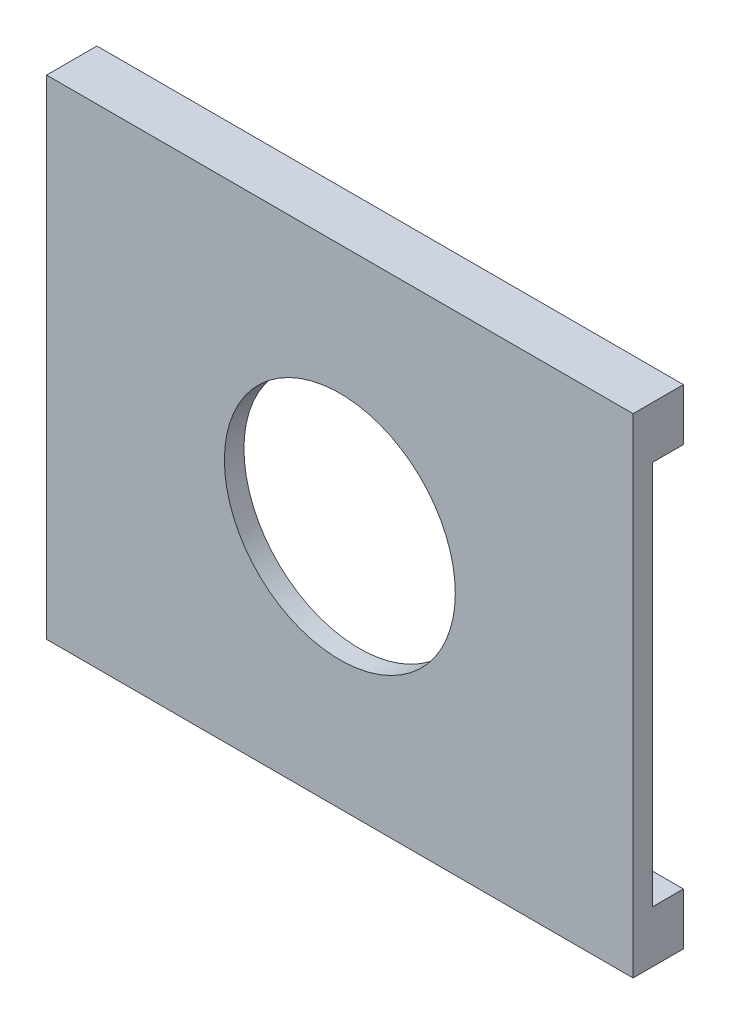
ISO-10303-21;
HEADER;
FILE_DESCRIPTION(('STEP AP214'),'2;1');
FILE_NAME('part.step','',(''),(''),'','','');
FILE_SCHEMA(('AUTOMOTIVE_DESIGN { 1 0 10303 214 1 1 1 1 }'));
ENDSEC;
DATA;
#1=APPLICATION_CONTEXT('core data for automotive mechanical design processes');
#2=APPLICATION_PROTOCOL_DEFINITION('international standard','automotive_design',2000,#1);
#3=PRODUCT_CONTEXT('',#1,'mechanical');
#4=PRODUCT('Part','Part','',(#3));
#5=PRODUCT_RELATED_PRODUCT_CATEGORY('part','',(#4));
#6=PRODUCT_DEFINITION_FORMATION('','',#4);
#7=PRODUCT_DEFINITION_CONTEXT('part definition',#1,'design');
#8=PRODUCT_DEFINITION('design','',#6,#7);
#9=PRODUCT_DEFINITION_SHAPE('','',#8);
#10=(LENGTH_UNIT() NAMED_UNIT(*) SI_UNIT(.MILLI.,.METRE.));
#11=(NAMED_UNIT(*) PLANE_ANGLE_UNIT() SI_UNIT($,.RADIAN.));
#12=(NAMED_UNIT(*) SI_UNIT($,.STERADIAN.) SOLID_ANGLE_UNIT());
#13=UNCERTAINTY_MEASURE_WITH_UNIT(LENGTH_MEASURE(1.E-05),#10,'distance_accuracy_value','');
#14=(GEOMETRIC_REPRESENTATION_CONTEXT(3) GLOBAL_UNCERTAINTY_ASSIGNED_CONTEXT((#13)) GLOBAL_UNIT_ASSIGNED_CONTEXT((#10,
#11,#12)) REPRESENTATION_CONTEXT('',''));
#15=CARTESIAN_POINT('',(0.,0.,0.));
#16=DIRECTION('',(0.,0.,1.));
#17=DIRECTION('',(1.,0.,0.));
#18=AXIS2_PLACEMENT_3D('',#15,#16,#17);
#19=CARTESIAN_POINT('',(0.,0.,0.));
#20=DIRECTION('',(0.,0.,-1.));
#21=DIRECTION('',(-1.,0.,0.));
#22=AXIS2_PLACEMENT_3D('',#19,#20,#21);
#23=PLANE('',#22);
#24=CARTESIAN_POINT('',(38.1,31.75,0.));
#25=DIRECTION('',(0.,0.,-1.));
#26=DIRECTION('',(-1.,0.,0.));
#27=AXIS2_PLACEMENT_3D('',#24,#25,#26);
#28=CIRCLE('',#27,15.);
#29=CARTESIAN_POINT('',(23.1,31.75,0.));
#30=VERTEX_POINT('',#29);
#31=EDGE_CURVE('E425',#30,#30,#28,.T.);
#32=ORIENTED_EDGE('',*,*,#31,.F.);
#33=EDGE_LOOP('',(#32));
#34=FACE_BOUND('',#33,.T.);
#35=DIRECTION('',(0.,1.,0.));
#36=VECTOR('',#35,1.);
#37=CARTESIAN_POINT('',(76.2,0.,0.));
#38=LINE('',#37,#36);
#39=CARTESIAN_POINT('',(76.2,6.75,0.));
#40=VERTEX_POINT('',#39);
#41=CARTESIAN_POINT('',(76.2,56.75,0.));
#42=VERTEX_POINT('',#41);
#43=EDGE_CURVE('E50',#40,#42,#38,.T.);
#44=ORIENTED_EDGE('',*,*,#43,.F.);
#45=DIRECTION('',(1.,0.,0.));
#46=VECTOR('',#45,1.);
#47=CARTESIAN_POINT('',(0.,6.75,0.));
#48=LINE('',#47,#46);
#49=CARTESIAN_POINT('',(0.,6.75,0.));
#50=VERTEX_POINT('',#49);
#51=EDGE_CURVE('E135',#50,#40,#48,.T.);
#52=ORIENTED_EDGE('',*,*,#51,.F.);
#53=DIRECTION('',(0.,-1.,0.));
#54=VECTOR('',#53,1.);
#55=CARTESIAN_POINT('',(0.,0.,0.));
#56=LINE('',#55,#54);
#57=CARTESIAN_POINT('',(0.,56.75,0.));
#58=VERTEX_POINT('',#57);
#59=EDGE_CURVE('E168',#58,#50,#56,.T.);
#60=ORIENTED_EDGE('',*,*,#59,.F.);
#61=DIRECTION('',(-1.,0.,0.));
#62=VECTOR('',#61,1.);
#63=CARTESIAN_POINT('',(0.,56.75,0.));
#64=LINE('',#63,#62);
#65=EDGE_CURVE('E148',#42,#58,#64,.T.);
#66=ORIENTED_EDGE('',*,*,#65,.F.);
#67=EDGE_LOOP('',(#44,#52,#60,#66));
#68=FACE_BOUND('',#67,.T.);
#69=ADVANCED_FACE('F46',(#34,#68),#23,.T.);
#70=CARTESIAN_POINT('',(0.,0.,2.54));
#71=DIRECTION('',(1.,0.,0.));
#72=DIRECTION('',(0.,0.,-1.));
#73=AXIS2_PLACEMENT_3D('',#70,#71,#72);
#74=PLANE('',#73);
#75=DIRECTION('',(0.,0.,-1.));
#76=VECTOR('',#75,1.);
#77=CARTESIAN_POINT('',(0.,63.5,2.54));
#78=LINE('',#77,#76);
#79=CARTESIAN_POINT('',(0.,63.5,2.54));
#80=VERTEX_POINT('',#79);
#81=CARTESIAN_POINT('',(0.,63.5,-4.));
#82=VERTEX_POINT('',#81);
#83=EDGE_CURVE('E188',#80,#82,#78,.T.);
#84=ORIENTED_EDGE('',*,*,#83,.T.);
#85=DIRECTION('',(0.,1.,0.));
#86=VECTOR('',#85,1.);
#87=CARTESIAN_POINT('',(0.,63.5,-4.));
#88=LINE('',#87,#86);
#89=CARTESIAN_POINT('',(0.,56.75,-4.));
#90=VERTEX_POINT('',#89);
#91=EDGE_CURVE('E156',#90,#82,#88,.T.);
#92=ORIENTED_EDGE('',*,*,#91,.F.);
#93=DIRECTION('',(0.,0.,1.));
#94=VECTOR('',#93,1.);
#95=CARTESIAN_POINT('',(0.,56.75,-4.));
#96=LINE('',#95,#94);
#97=EDGE_CURVE('E159',#90,#58,#96,.T.);
#98=ORIENTED_EDGE('',*,*,#97,.T.);
#99=ORIENTED_EDGE('',*,*,#59,.T.);
#100=DIRECTION('',(0.,0.,1.));
#101=VECTOR('',#100,1.);
#102=CARTESIAN_POINT('',(0.,6.75,-4.));
#103=LINE('',#102,#101);
#104=CARTESIAN_POINT('',(0.,6.75,-4.));
#105=VERTEX_POINT('',#104);
#106=EDGE_CURVE('E64',#105,#50,#103,.T.);
#107=ORIENTED_EDGE('',*,*,#106,.F.);
#108=DIRECTION('',(0.,1.,0.));
#109=VECTOR('',#108,1.);
#110=CARTESIAN_POINT('',(0.,0.,-4.));
#111=LINE('',#110,#109);
#112=CARTESIAN_POINT('',(0.,0.,-4.));
#113=VERTEX_POINT('',#112);
#114=EDGE_CURVE('E130',#113,#105,#111,.T.);
#115=ORIENTED_EDGE('',*,*,#114,.F.);
#116=DIRECTION('',(0.,0.,-1.));
#117=VECTOR('',#116,1.);
#118=CARTESIAN_POINT('',(0.,0.,2.54));
#119=LINE('',#118,#117);
#120=CARTESIAN_POINT('',(0.,0.,2.54));
#121=VERTEX_POINT('',#120);
#122=EDGE_CURVE('E13',#121,#113,#119,.T.);
#123=ORIENTED_EDGE('',*,*,#122,.F.);
#124=DIRECTION('',(0.,-1.,0.));
#125=VECTOR('',#124,1.);
#126=CARTESIAN_POINT('',(0.,0.,2.54));
#127=LINE('',#126,#125);
#128=EDGE_CURVE('E162',#80,#121,#127,.T.);
#129=ORIENTED_EDGE('',*,*,#128,.F.);
#130=EDGE_LOOP('',(#84,#92,#98,#99,#107,#115,#123,#129));
#131=FACE_BOUND('',#130,.T.);
#132=ADVANCED_FACE('F48',(#131),#74,.F.);
#133=CARTESIAN_POINT('',(0.,0.,2.54));
#134=DIRECTION('',(0.,1.,0.));
#135=DIRECTION('',(0.,0.,1.));
#136=AXIS2_PLACEMENT_3D('',#133,#134,#135);
#137=PLANE('',#136);
#138=ORIENTED_EDGE('',*,*,#122,.T.);
#139=DIRECTION('',(-1.,0.,0.));
#140=VECTOR('',#139,1.);
#141=CARTESIAN_POINT('',(76.2,0.,-4.));
#142=LINE('',#141,#140);
#143=CARTESIAN_POINT('',(76.2,0.,-4.));
#144=VERTEX_POINT('',#143);
#145=EDGE_CURVE('E125',#144,#113,#142,.T.);
#146=ORIENTED_EDGE('',*,*,#145,.F.);
#147=DIRECTION('',(0.,0.,-1.));
#148=VECTOR('',#147,1.);
#149=CARTESIAN_POINT('',(76.2,0.,2.54));
#150=LINE('',#149,#148);
#151=CARTESIAN_POINT('',(76.2,0.,2.54));
#152=VERTEX_POINT('',#151);
#153=EDGE_CURVE('E56',#152,#144,#150,.T.);
#154=ORIENTED_EDGE('',*,*,#153,.F.);
#155=DIRECTION('',(1.,0.,0.));
#156=VECTOR('',#155,1.);
#157=CARTESIAN_POINT('',(0.,0.,2.54));
#158=LINE('',#157,#156);
#159=EDGE_CURVE('E182',#121,#152,#158,.T.);
#160=ORIENTED_EDGE('',*,*,#159,.F.);
#161=EDGE_LOOP('',(#138,#146,#154,#160));
#162=FACE_BOUND('',#161,.T.);
#163=ADVANCED_FACE('F126',(#162),#137,.F.);
#164=CARTESIAN_POINT('',(76.2,0.,2.54));
#165=DIRECTION('',(-1.,0.,0.));
#166=DIRECTION('',(0.,0.,1.));
#167=AXIS2_PLACEMENT_3D('',#164,#165,#166);
#168=PLANE('',#167);
#169=ORIENTED_EDGE('',*,*,#153,.T.);
#170=DIRECTION('',(0.,-1.,0.));
#171=VECTOR('',#170,1.);
#172=CARTESIAN_POINT('',(76.2,6.75,-4.));
#173=LINE('',#172,#171);
#174=CARTESIAN_POINT('',(76.2,6.75,-4.));
#175=VERTEX_POINT('',#174);
#176=EDGE_CURVE('E118',#175,#144,#173,.T.);
#177=ORIENTED_EDGE('',*,*,#176,.F.);
#178=DIRECTION('',(0.,0.,1.));
#179=VECTOR('',#178,1.);
#180=CARTESIAN_POINT('',(76.2,6.75,-4.));
#181=LINE('',#180,#179);
#182=EDGE_CURVE('E144',#175,#40,#181,.T.);
#183=ORIENTED_EDGE('',*,*,#182,.T.);
#184=ORIENTED_EDGE('',*,*,#43,.T.);
#185=DIRECTION('',(0.,0.,1.));
#186=VECTOR('',#185,1.);
#187=CARTESIAN_POINT('',(76.2,56.75,-4.));
#188=LINE('',#187,#186);
#189=CARTESIAN_POINT('',(76.2,56.75,-4.));
#190=VERTEX_POINT('',#189);
#191=EDGE_CURVE('E172',#190,#42,#188,.T.);
#192=ORIENTED_EDGE('',*,*,#191,.F.);
#193=DIRECTION('',(0.,-1.,0.));
#194=VECTOR('',#193,1.);
#195=CARTESIAN_POINT('',(76.2,56.75,-4.));
#196=LINE('',#195,#194);
#197=CARTESIAN_POINT('',(76.2,63.5,-4.));
#198=VERTEX_POINT('',#197);
#199=EDGE_CURVE('E152',#198,#190,#196,.T.);
#200=ORIENTED_EDGE('',*,*,#199,.F.);
#201=DIRECTION('',(0.,0.,-1.));
#202=VECTOR('',#201,1.);
#203=CARTESIAN_POINT('',(76.2,63.5,2.54));
#204=LINE('',#203,#202);
#205=CARTESIAN_POINT('',(76.2,63.5,2.54));
#206=VERTEX_POINT('',#205);
#207=EDGE_CURVE('E122',#206,#198,#204,.T.);
#208=ORIENTED_EDGE('',*,*,#207,.F.);
#209=DIRECTION('',(0.,1.,0.));
#210=VECTOR('',#209,1.);
#211=CARTESIAN_POINT('',(76.2,0.,2.54));
#212=LINE('',#211,#210);
#213=EDGE_CURVE('E120',#152,#206,#212,.T.);
#214=ORIENTED_EDGE('',*,*,#213,.F.);
#215=EDGE_LOOP('',(#169,#177,#183,#184,#192,#200,#208,#214));
#216=FACE_BOUND('',#215,.T.);
#217=ADVANCED_FACE('F116',(#216),#168,.F.);
#218=CARTESIAN_POINT('',(0.,63.5,2.54));
#219=DIRECTION('',(0.,-1.,0.));
#220=DIRECTION('',(0.,0.,-1.));
#221=AXIS2_PLACEMENT_3D('',#218,#219,#220);
#222=PLANE('',#221);
#223=ORIENTED_EDGE('',*,*,#207,.T.);
#224=DIRECTION('',(1.,0.,0.));
#225=VECTOR('',#224,1.);
#226=CARTESIAN_POINT('',(76.2,63.5,-4.));
#227=LINE('',#226,#225);
#228=EDGE_CURVE('E149',#82,#198,#227,.T.);
#229=ORIENTED_EDGE('',*,*,#228,.F.);
#230=ORIENTED_EDGE('',*,*,#83,.F.);
#231=DIRECTION('',(-1.,0.,0.));
#232=VECTOR('',#231,1.);
#233=CARTESIAN_POINT('',(0.,63.5,2.54));
#234=LINE('',#233,#232);
#235=EDGE_CURVE('E185',#206,#80,#234,.T.);
#236=ORIENTED_EDGE('',*,*,#235,.F.);
#237=EDGE_LOOP('',(#223,#229,#230,#236));
#238=FACE_BOUND('',#237,.T.);
#239=ADVANCED_FACE('F197',(#238),#222,.F.);
#240=CARTESIAN_POINT('',(0.,0.,2.54));
#241=DIRECTION('',(0.,0.,-1.));
#242=DIRECTION('',(-1.,0.,0.));
#243=AXIS2_PLACEMENT_3D('',#240,#241,#242);
#244=PLANE('',#243);
#245=CARTESIAN_POINT('',(38.1,31.75,2.54));
#246=DIRECTION('',(0.,0.,1.));
#247=DIRECTION('',(1.,0.,0.));
#248=AXIS2_PLACEMENT_3D('',#245,#246,#247);
#249=CIRCLE('',#248,15.);
#250=CARTESIAN_POINT('',(53.1,31.75,2.54));
#251=VERTEX_POINT('',#250);
#252=EDGE_CURVE('E430',#251,#251,#249,.T.);
#253=ORIENTED_EDGE('',*,*,#252,.F.);
#254=EDGE_LOOP('',(#253));
#255=FACE_BOUND('',#254,.T.);
#256=ORIENTED_EDGE('',*,*,#128,.T.);
#257=ORIENTED_EDGE('',*,*,#159,.T.);
#258=ORIENTED_EDGE('',*,*,#213,.T.);
#259=ORIENTED_EDGE('',*,*,#235,.T.);
#260=EDGE_LOOP('',(#256,#257,#258,#259));
#261=FACE_BOUND('',#260,.T.);
#262=ADVANCED_FACE('F207',(#255,#261),#244,.F.);
#263=CARTESIAN_POINT('',(0.,56.75,-4.));
#264=DIRECTION('',(0.,1.,0.));
#265=DIRECTION('',(0.,0.,1.));
#266=AXIS2_PLACEMENT_3D('',#263,#264,#265);
#267=PLANE('',#266);
#268=ORIENTED_EDGE('',*,*,#65,.T.);
#269=ORIENTED_EDGE('',*,*,#97,.F.);
#270=DIRECTION('',(-1.,0.,0.));
#271=VECTOR('',#270,1.);
#272=CARTESIAN_POINT('',(0.,56.75,-4.));
#273=LINE('',#272,#271);
#274=EDGE_CURVE('E154',#190,#90,#273,.T.);
#275=ORIENTED_EDGE('',*,*,#274,.F.);
#276=ORIENTED_EDGE('',*,*,#191,.T.);
#277=EDGE_LOOP('',(#268,#269,#275,#276));
#278=FACE_BOUND('',#277,.T.);
#279=ADVANCED_FACE('F205',(#278),#267,.F.);
#280=CARTESIAN_POINT('',(0.,0.,-4.));
#281=DIRECTION('',(0.,0.,1.));
#282=DIRECTION('',(1.,0.,0.));
#283=AXIS2_PLACEMENT_3D('',#280,#281,#282);
#284=PLANE('',#283);
#285=CARTESIAN_POINT('',(12.7,60.125,-4.));
#286=DIRECTION('',(0.,0.,-1.));
#287=DIRECTION('',(1.,0.,0.));
#288=AXIS2_PLACEMENT_3D('',#285,#286,#287);
#289=CIRCLE('',#288,2.032);
#290=CARTESIAN_POINT('',(10.668,60.125,-4.));
#291=VERTEX_POINT('',#290);
#292=EDGE_CURVE('E422',#291,#291,#289,.T.);
#293=ORIENTED_EDGE('',*,*,#292,.F.);
#294=EDGE_LOOP('',(#293));
#295=FACE_BOUND('',#294,.T.);
#296=CARTESIAN_POINT('',(63.5,60.125,-4.));
#297=DIRECTION('',(0.,0.,-1.));
#298=DIRECTION('',(-1.,0.,0.));
#299=AXIS2_PLACEMENT_3D('',#296,#297,#298);
#300=CIRCLE('',#299,2.032);
#301=CARTESIAN_POINT('',(61.468,60.125,-4.));
#302=VERTEX_POINT('',#301);
#303=EDGE_CURVE('E140',#302,#302,#300,.T.);
#304=ORIENTED_EDGE('',*,*,#303,.F.);
#305=EDGE_LOOP('',(#304));
#306=FACE_BOUND('',#305,.T.);
#307=ORIENTED_EDGE('',*,*,#228,.T.);
#308=ORIENTED_EDGE('',*,*,#199,.T.);
#309=ORIENTED_EDGE('',*,*,#274,.T.);
#310=ORIENTED_EDGE('',*,*,#91,.T.);
#311=EDGE_LOOP('',(#307,#308,#309,#310));
#312=FACE_BOUND('',#311,.T.);
#313=ADVANCED_FACE('F200',(#295,#306,#312),#284,.F.);
#314=CARTESIAN_POINT('',(0.,6.75,-4.));
#315=DIRECTION('',(0.,-1.,0.));
#316=DIRECTION('',(0.,0.,-1.));
#317=AXIS2_PLACEMENT_3D('',#314,#315,#316);
#318=PLANE('',#317);
#319=ORIENTED_EDGE('',*,*,#51,.T.);
#320=ORIENTED_EDGE('',*,*,#182,.F.);
#321=DIRECTION('',(1.,0.,0.));
#322=VECTOR('',#321,1.);
#323=CARTESIAN_POINT('',(0.,6.75,-4.));
#324=LINE('',#323,#322);
#325=EDGE_CURVE('E133',#105,#175,#324,.T.);
#326=ORIENTED_EDGE('',*,*,#325,.F.);
#327=ORIENTED_EDGE('',*,*,#106,.T.);
#328=EDGE_LOOP('',(#319,#320,#326,#327));
#329=FACE_BOUND('',#328,.T.);
#330=ADVANCED_FACE('F203',(#329),#318,.F.);
#331=CARTESIAN_POINT('',(0.,0.,-4.));
#332=DIRECTION('',(0.,0.,-1.));
#333=DIRECTION('',(-1.,0.,0.));
#334=AXIS2_PLACEMENT_3D('',#331,#332,#333);
#335=PLANE('',#334);
#336=CARTESIAN_POINT('',(12.7,3.375,-4.));
#337=DIRECTION('',(0.,0.,-1.));
#338=DIRECTION('',(-1.,0.,0.));
#339=AXIS2_PLACEMENT_3D('',#336,#337,#338);
#340=CIRCLE('',#339,2.032);
#341=CARTESIAN_POINT('',(10.668,3.375,-4.));
#342=VERTEX_POINT('',#341);
#343=EDGE_CURVE('E401',#342,#342,#340,.T.);
#344=ORIENTED_EDGE('',*,*,#343,.F.);
#345=EDGE_LOOP('',(#344));
#346=FACE_BOUND('',#345,.T.);
#347=CARTESIAN_POINT('',(63.5,3.375,-4.));
#348=DIRECTION('',(0.,0.,-1.));
#349=DIRECTION('',(1.,0.,0.));
#350=AXIS2_PLACEMENT_3D('',#347,#348,#349);
#351=CIRCLE('',#350,2.032);
#352=CARTESIAN_POINT('',(61.468,3.375,-4.));
#353=VERTEX_POINT('',#352);
#354=EDGE_CURVE('E404',#353,#353,#351,.T.);
#355=ORIENTED_EDGE('',*,*,#354,.F.);
#356=EDGE_LOOP('',(#355));
#357=FACE_BOUND('',#356,.T.);
#358=ORIENTED_EDGE('',*,*,#176,.T.);
#359=ORIENTED_EDGE('',*,*,#145,.T.);
#360=ORIENTED_EDGE('',*,*,#114,.T.);
#361=ORIENTED_EDGE('',*,*,#325,.T.);
#362=EDGE_LOOP('',(#358,#359,#360,#361));
#363=FACE_BOUND('',#362,.T.);
#364=ADVANCED_FACE('F132',(#346,#357,#363),#335,.T.);
#365=CARTESIAN_POINT('',(63.5,60.125,-0.190000000000001));
#366=DIRECTION('',(0.,0.,-1.));
#367=DIRECTION('',(-1.,0.,0.));
#368=AXIS2_PLACEMENT_3D('',#365,#366,#367);
#369=CYLINDRICAL_SURFACE('',#368,2.032);
#370=CARTESIAN_POINT('',(63.5,60.125,-0.190000000000001));
#371=DIRECTION('',(0.,0.,-1.));
#372=DIRECTION('',(-1.,0.,0.));
#373=AXIS2_PLACEMENT_3D('',#370,#371,#372);
#374=CIRCLE('',#373,2.032);
#375=CARTESIAN_POINT('',(61.468,60.125,-0.19));
#376=VERTEX_POINT('',#375);
#377=EDGE_CURVE('E137',#376,#376,#374,.T.);
#378=CARTESIAN_POINT('',(61.468,60.125,-0.19));
#379=CARTESIAN_POINT('',(61.468,60.125,-0.229687500000001));
#380=CARTESIAN_POINT('',(61.468,60.125,-0.269375));
#381=CARTESIAN_POINT('',(61.468,60.125,-0.34875));
#382=CARTESIAN_POINT('',(61.468,60.125,-0.3884375));
#383=CARTESIAN_POINT('',(61.468,60.125,-0.4678125));
#384=CARTESIAN_POINT('',(61.468,60.125,-0.5075));
#385=CARTESIAN_POINT('',(61.468,60.125,-0.586875));
#386=CARTESIAN_POINT('',(61.468,60.125,-0.6265625));
#387=CARTESIAN_POINT('',(61.468,60.125,-0.7059375));
#388=CARTESIAN_POINT('',(61.468,60.125,-0.745625));
#389=CARTESIAN_POINT('',(61.468,60.125,-0.825));
#390=CARTESIAN_POINT('',(61.468,60.125,-0.8646875));
#391=CARTESIAN_POINT('',(61.468,60.125,-0.9440625));
#392=CARTESIAN_POINT('',(61.468,60.125,-0.98375));
#393=CARTESIAN_POINT('',(61.468,60.125,-1.063125));
#394=CARTESIAN_POINT('',(61.468,60.125,-1.1028125));
#395=CARTESIAN_POINT('',(61.468,60.125,-1.1821875));
#396=CARTESIAN_POINT('',(61.468,60.125,-1.221875));
#397=CARTESIAN_POINT('',(61.468,60.125,-1.30125));
#398=CARTESIAN_POINT('',(61.468,60.125,-1.3409375));
#399=CARTESIAN_POINT('',(61.468,60.125,-1.4203125));
#400=CARTESIAN_POINT('',(61.468,60.125,-1.46));
#401=CARTESIAN_POINT('',(61.468,60.125,-1.539375));
#402=CARTESIAN_POINT('',(61.468,60.125,-1.5790625));
#403=CARTESIAN_POINT('',(61.468,60.125,-1.6584375));
#404=CARTESIAN_POINT('',(61.468,60.125,-1.698125));
#405=CARTESIAN_POINT('',(61.468,60.125,-1.7775));
#406=CARTESIAN_POINT('',(61.468,60.125,-1.8171875));
#407=CARTESIAN_POINT('',(61.468,60.125,-1.8965625));
#408=CARTESIAN_POINT('',(61.468,60.125,-1.93625));
#409=CARTESIAN_POINT('',(61.468,60.125,-2.015625));
#410=CARTESIAN_POINT('',(61.468,60.125,-2.0553125));
#411=CARTESIAN_POINT('',(61.468,60.125,-2.1346875));
#412=CARTESIAN_POINT('',(61.468,60.125,-2.174375));
#413=CARTESIAN_POINT('',(61.468,60.125,-2.25375));
#414=CARTESIAN_POINT('',(61.468,60.125,-2.2934375));
#415=CARTESIAN_POINT('',(61.468,60.125,-2.3728125));
#416=CARTESIAN_POINT('',(61.468,60.125,-2.4125));
#417=CARTESIAN_POINT('',(61.468,60.125,-2.491875));
#418=CARTESIAN_POINT('',(61.468,60.125,-2.5315625));
#419=CARTESIAN_POINT('',(61.468,60.125,-2.6109375));
#420=CARTESIAN_POINT('',(61.468,60.125,-2.650625));
#421=CARTESIAN_POINT('',(61.468,60.125,-2.73));
#422=CARTESIAN_POINT('',(61.468,60.125,-2.7696875));
#423=CARTESIAN_POINT('',(61.468,60.125,-2.8490625));
#424=CARTESIAN_POINT('',(61.468,60.125,-2.88875));
#425=CARTESIAN_POINT('',(61.468,60.125,-2.968125));
#426=CARTESIAN_POINT('',(61.468,60.125,-3.0078125));
#427=CARTESIAN_POINT('',(61.468,60.125,-3.0871875));
#428=CARTESIAN_POINT('',(61.468,60.125,-3.126875));
#429=CARTESIAN_POINT('',(61.468,60.125,-3.20625));
#430=CARTESIAN_POINT('',(61.468,60.125,-3.2459375));
#431=CARTESIAN_POINT('',(61.468,60.125,-3.3253125));
#432=CARTESIAN_POINT('',(61.468,60.125,-3.365));
#433=CARTESIAN_POINT('',(61.468,60.125,-3.444375));
#434=CARTESIAN_POINT('',(61.468,60.125,-3.4840625));
#435=CARTESIAN_POINT('',(61.468,60.125,-3.5634375));
#436=CARTESIAN_POINT('',(61.468,60.125,-3.603125));
#437=CARTESIAN_POINT('',(61.468,60.125,-3.6825));
#438=CARTESIAN_POINT('',(61.468,60.125,-3.7221875));
#439=CARTESIAN_POINT('',(61.468,60.125,-3.8015625));
#440=CARTESIAN_POINT('',(61.468,60.125,-3.84125));
#441=CARTESIAN_POINT('',(61.468,60.125,-3.920625));
#442=CARTESIAN_POINT('',(61.468,60.125,-3.9603125));
#443=CARTESIAN_POINT('',(61.468,60.125,-4.));
#444=B_SPLINE_CURVE_WITH_KNOTS('',3,(#378,#379,#380,#381,#382,#383,#384,#385,#386,#387,#388,
#389,#390,#391,#392,#393,#394,#395,#396,#397,#398,#399,#400,#401,#402,#403,#404,#405,#406,#407,
#408,#409,#410,#411,#412,#413,#414,#415,#416,#417,#418,#419,#420,#421,#422,#423,#424,#425,#426,
#427,#428,#429,#430,#431,#432,#433,#434,#435,#436,#437,#438,#439,#440,#441,#442,#443),
.UNSPECIFIED.,.F.,.F.,(4,2,2,2,2,2,2,2,2,2,2,2,2,2,2,2,2,2,2,2,2,2,2,2,2,2,2,2,2,2,2,2,4),(0.,
0.1190625,0.238125,0.3571875,0.47625,0.5953125,0.714375,0.833437499999999,0.9525,1.0715625,
1.190625,1.3096875,1.42875,1.5478125,1.666875,1.7859375,1.905,2.0240625,2.143125,2.2621875,
2.38125,2.5003125,2.619375,2.7384375,2.8575,2.9765625,3.095625,3.2146875,3.33375,3.4528125,
3.571875,3.6909375,3.81),.UNSPECIFIED.);
#445=EDGE_CURVE('BSEAM314',#376,#302,#444,.T.);
#446=ORIENTED_EDGE('',*,*,#377,.F.);
#447=ORIENTED_EDGE('',*,*,#303,.T.);
#448=ORIENTED_EDGE('',*,*,#445,.T.);
#449=ORIENTED_EDGE('',*,*,#445,.F.);
#450=EDGE_LOOP('',(#446,#448,#447,#449));
#451=FACE_BOUND('',#450,.T.);
#452=ADVANCED_FACE('F314',(#451),#369,.F.);
#453=CARTESIAN_POINT('',(63.5,60.125,-0.190000000000001));
#454=DIRECTION('',(0.,0.,-1.));
#455=DIRECTION('',(-1.,0.,0.));
#456=AXIS2_PLACEMENT_3D('',#453,#454,#455);
#457=PLANE('',#456);
#458=ORIENTED_EDGE('',*,*,#377,.T.);
#459=EDGE_LOOP('',(#458));
#460=FACE_BOUND('',#459,.T.);
#461=ADVANCED_FACE('F306',(#460),#457,.T.);
#462=CARTESIAN_POINT('',(63.5,3.375,-0.190000000000001));
#463=DIRECTION('',(0.,0.,-1.));
#464=DIRECTION('',(-1.,0.,0.));
#465=AXIS2_PLACEMENT_3D('',#462,#463,#464);
#466=CYLINDRICAL_SURFACE('',#465,2.032);
#467=CARTESIAN_POINT('',(63.5,3.375,-0.190000000000001));
#468=DIRECTION('',(0.,0.,-1.));
#469=DIRECTION('',(1.,0.,0.));
#470=AXIS2_PLACEMENT_3D('',#467,#468,#469);
#471=CIRCLE('',#470,2.032);
#472=CARTESIAN_POINT('',(61.468,3.375,-0.19));
#473=VERTEX_POINT('',#472);
#474=EDGE_CURVE('E406',#473,#473,#471,.T.);
#475=CARTESIAN_POINT('',(61.468,3.375,-0.19));
#476=CARTESIAN_POINT('',(61.468,3.375,-0.229687500000001));
#477=CARTESIAN_POINT('',(61.468,3.375,-0.269375));
#478=CARTESIAN_POINT('',(61.468,3.375,-0.34875));
#479=CARTESIAN_POINT('',(61.468,3.375,-0.3884375));
#480=CARTESIAN_POINT('',(61.468,3.375,-0.4678125));
#481=CARTESIAN_POINT('',(61.468,3.375,-0.5075));
#482=CARTESIAN_POINT('',(61.468,3.375,-0.586875));
#483=CARTESIAN_POINT('',(61.468,3.375,-0.6265625));
#484=CARTESIAN_POINT('',(61.468,3.375,-0.7059375));
#485=CARTESIAN_POINT('',(61.468,3.375,-0.745625));
#486=CARTESIAN_POINT('',(61.468,3.375,-0.825));
#487=CARTESIAN_POINT('',(61.468,3.375,-0.8646875));
#488=CARTESIAN_POINT('',(61.468,3.375,-0.9440625));
#489=CARTESIAN_POINT('',(61.468,3.375,-0.98375));
#490=CARTESIAN_POINT('',(61.468,3.375,-1.063125));
#491=CARTESIAN_POINT('',(61.468,3.375,-1.1028125));
#492=CARTESIAN_POINT('',(61.468,3.375,-1.1821875));
#493=CARTESIAN_POINT('',(61.468,3.375,-1.221875));
#494=CARTESIAN_POINT('',(61.468,3.375,-1.30125));
#495=CARTESIAN_POINT('',(61.468,3.375,-1.3409375));
#496=CARTESIAN_POINT('',(61.468,3.375,-1.4203125));
#497=CARTESIAN_POINT('',(61.468,3.375,-1.46));
#498=CARTESIAN_POINT('',(61.468,3.375,-1.539375));
#499=CARTESIAN_POINT('',(61.468,3.375,-1.5790625));
#500=CARTESIAN_POINT('',(61.468,3.375,-1.6584375));
#501=CARTESIAN_POINT('',(61.468,3.375,-1.698125));
#502=CARTESIAN_POINT('',(61.468,3.375,-1.7775));
#503=CARTESIAN_POINT('',(61.468,3.375,-1.8171875));
#504=CARTESIAN_POINT('',(61.468,3.375,-1.8965625));
#505=CARTESIAN_POINT('',(61.468,3.375,-1.93625));
#506=CARTESIAN_POINT('',(61.468,3.375,-2.015625));
#507=CARTESIAN_POINT('',(61.468,3.375,-2.0553125));
#508=CARTESIAN_POINT('',(61.468,3.375,-2.1346875));
#509=CARTESIAN_POINT('',(61.468,3.375,-2.174375));
#510=CARTESIAN_POINT('',(61.468,3.375,-2.25375));
#511=CARTESIAN_POINT('',(61.468,3.375,-2.2934375));
#512=CARTESIAN_POINT('',(61.468,3.375,-2.3728125));
#513=CARTESIAN_POINT('',(61.468,3.375,-2.4125));
#514=CARTESIAN_POINT('',(61.468,3.375,-2.491875));
#515=CARTESIAN_POINT('',(61.468,3.375,-2.5315625));
#516=CARTESIAN_POINT('',(61.468,3.375,-2.6109375));
#517=CARTESIAN_POINT('',(61.468,3.375,-2.650625));
#518=CARTESIAN_POINT('',(61.468,3.375,-2.73));
#519=CARTESIAN_POINT('',(61.468,3.375,-2.7696875));
#520=CARTESIAN_POINT('',(61.468,3.375,-2.8490625));
#521=CARTESIAN_POINT('',(61.468,3.375,-2.88875));
#522=CARTESIAN_POINT('',(61.468,3.375,-2.968125));
#523=CARTESIAN_POINT('',(61.468,3.375,-3.0078125));
#524=CARTESIAN_POINT('',(61.468,3.375,-3.0871875));
#525=CARTESIAN_POINT('',(61.468,3.375,-3.126875));
#526=CARTESIAN_POINT('',(61.468,3.375,-3.20625));
#527=CARTESIAN_POINT('',(61.468,3.375,-3.2459375));
#528=CARTESIAN_POINT('',(61.468,3.375,-3.3253125));
#529=CARTESIAN_POINT('',(61.468,3.375,-3.365));
#530=CARTESIAN_POINT('',(61.468,3.375,-3.444375));
#531=CARTESIAN_POINT('',(61.468,3.375,-3.4840625));
#532=CARTESIAN_POINT('',(61.468,3.375,-3.5634375));
#533=CARTESIAN_POINT('',(61.468,3.375,-3.603125));
#534=CARTESIAN_POINT('',(61.468,3.375,-3.6825));
#535=CARTESIAN_POINT('',(61.468,3.375,-3.7221875));
#536=CARTESIAN_POINT('',(61.468,3.375,-3.8015625));
#537=CARTESIAN_POINT('',(61.468,3.375,-3.84125));
#538=CARTESIAN_POINT('',(61.468,3.375,-3.920625));
#539=CARTESIAN_POINT('',(61.468,3.375,-3.9603125));
#540=CARTESIAN_POINT('',(61.468,3.375,-4.));
#541=B_SPLINE_CURVE_WITH_KNOTS('',3,(#475,#476,#477,#478,#479,#480,#481,#482,#483,#484,#485,
#486,#487,#488,#489,#490,#491,#492,#493,#494,#495,#496,#497,#498,#499,#500,#501,#502,#503,#504,
#505,#506,#507,#508,#509,#510,#511,#512,#513,#514,#515,#516,#517,#518,#519,#520,#521,#522,#523,
#524,#525,#526,#527,#528,#529,#530,#531,#532,#533,#534,#535,#536,#537,#538,#539,#540),
.UNSPECIFIED.,.F.,.F.,(4,2,2,2,2,2,2,2,2,2,2,2,2,2,2,2,2,2,2,2,2,2,2,2,2,2,2,2,2,2,2,2,4),(0.,
0.1190625,0.238125,0.3571875,0.47625,0.5953125,0.714375,0.833437499999999,0.9525,1.0715625,
1.190625,1.3096875,1.42875,1.5478125,1.666875,1.7859375,1.905,2.0240625,2.143125,2.2621875,
2.38125,2.5003125,2.619375,2.7384375,2.8575,2.9765625,3.095625,3.2146875,3.33375,3.4528125,
3.571875,3.6909375,3.81),.UNSPECIFIED.);
#542=EDGE_CURVE('BSEAM298',#473,#353,#541,.T.);
#543=ORIENTED_EDGE('',*,*,#474,.F.);
#544=ORIENTED_EDGE('',*,*,#354,.T.);
#545=ORIENTED_EDGE('',*,*,#542,.T.);
#546=ORIENTED_EDGE('',*,*,#542,.F.);
#547=EDGE_LOOP('',(#543,#545,#544,#546));
#548=FACE_BOUND('',#547,.T.);
#549=ADVANCED_FACE('F298',(#548),#466,.F.);
#550=CARTESIAN_POINT('',(63.5,3.375,-0.190000000000001));
#551=DIRECTION('',(0.,0.,1.));
#552=DIRECTION('',(1.,0.,0.));
#553=AXIS2_PLACEMENT_3D('',#550,#551,#552);
#554=PLANE('',#553);
#555=ORIENTED_EDGE('',*,*,#474,.T.);
#556=EDGE_LOOP('',(#555));
#557=FACE_BOUND('',#556,.T.);
#558=ADVANCED_FACE('F290',(#557),#554,.F.);
#559=CARTESIAN_POINT('',(12.7,3.375,-0.190000000000001));
#560=DIRECTION('',(0.,0.,-1.));
#561=DIRECTION('',(-1.,0.,0.));
#562=AXIS2_PLACEMENT_3D('',#559,#560,#561);
#563=CYLINDRICAL_SURFACE('',#562,2.032);
#564=CARTESIAN_POINT('',(12.7,3.375,-0.190000000000001));
#565=DIRECTION('',(0.,0.,-1.));
#566=DIRECTION('',(-1.,0.,0.));
#567=AXIS2_PLACEMENT_3D('',#564,#565,#566);
#568=CIRCLE('',#567,2.032);
#569=CARTESIAN_POINT('',(10.668,3.375,-0.19));
#570=VERTEX_POINT('',#569);
#571=EDGE_CURVE('E407',#570,#570,#568,.T.);
#572=CARTESIAN_POINT('',(10.668,3.375,-0.19));
#573=CARTESIAN_POINT('',(10.668,3.375,-0.229687500000001));
#574=CARTESIAN_POINT('',(10.668,3.375,-0.269375));
#575=CARTESIAN_POINT('',(10.668,3.375,-0.34875));
#576=CARTESIAN_POINT('',(10.668,3.375,-0.3884375));
#577=CARTESIAN_POINT('',(10.668,3.375,-0.4678125));
#578=CARTESIAN_POINT('',(10.668,3.375,-0.5075));
#579=CARTESIAN_POINT('',(10.668,3.375,-0.586875));
#580=CARTESIAN_POINT('',(10.668,3.375,-0.6265625));
#581=CARTESIAN_POINT('',(10.668,3.375,-0.7059375));
#582=CARTESIAN_POINT('',(10.668,3.375,-0.745625));
#583=CARTESIAN_POINT('',(10.668,3.375,-0.825));
#584=CARTESIAN_POINT('',(10.668,3.375,-0.8646875));
#585=CARTESIAN_POINT('',(10.668,3.375,-0.9440625));
#586=CARTESIAN_POINT('',(10.668,3.375,-0.98375));
#587=CARTESIAN_POINT('',(10.668,3.375,-1.063125));
#588=CARTESIAN_POINT('',(10.668,3.375,-1.1028125));
#589=CARTESIAN_POINT('',(10.668,3.375,-1.1821875));
#590=CARTESIAN_POINT('',(10.668,3.375,-1.221875));
#591=CARTESIAN_POINT('',(10.668,3.375,-1.30125));
#592=CARTESIAN_POINT('',(10.668,3.375,-1.3409375));
#593=CARTESIAN_POINT('',(10.668,3.375,-1.4203125));
#594=CARTESIAN_POINT('',(10.668,3.375,-1.46));
#595=CARTESIAN_POINT('',(10.668,3.375,-1.539375));
#596=CARTESIAN_POINT('',(10.668,3.375,-1.5790625));
#597=CARTESIAN_POINT('',(10.668,3.375,-1.6584375));
#598=CARTESIAN_POINT('',(10.668,3.375,-1.698125));
#599=CARTESIAN_POINT('',(10.668,3.375,-1.7775));
#600=CARTESIAN_POINT('',(10.668,3.375,-1.8171875));
#601=CARTESIAN_POINT('',(10.668,3.375,-1.8965625));
#602=CARTESIAN_POINT('',(10.668,3.375,-1.93625));
#603=CARTESIAN_POINT('',(10.668,3.375,-2.015625));
#604=CARTESIAN_POINT('',(10.668,3.375,-2.0553125));
#605=CARTESIAN_POINT('',(10.668,3.375,-2.1346875));
#606=CARTESIAN_POINT('',(10.668,3.375,-2.174375));
#607=CARTESIAN_POINT('',(10.668,3.375,-2.25375));
#608=CARTESIAN_POINT('',(10.668,3.375,-2.2934375));
#609=CARTESIAN_POINT('',(10.668,3.375,-2.3728125));
#610=CARTESIAN_POINT('',(10.668,3.375,-2.4125));
#611=CARTESIAN_POINT('',(10.668,3.375,-2.491875));
#612=CARTESIAN_POINT('',(10.668,3.375,-2.5315625));
#613=CARTESIAN_POINT('',(10.668,3.375,-2.6109375));
#614=CARTESIAN_POINT('',(10.668,3.375,-2.650625));
#615=CARTESIAN_POINT('',(10.668,3.375,-2.73));
#616=CARTESIAN_POINT('',(10.668,3.375,-2.7696875));
#617=CARTESIAN_POINT('',(10.668,3.375,-2.8490625));
#618=CARTESIAN_POINT('',(10.668,3.375,-2.88875));
#619=CARTESIAN_POINT('',(10.668,3.375,-2.968125));
#620=CARTESIAN_POINT('',(10.668,3.375,-3.0078125));
#621=CARTESIAN_POINT('',(10.668,3.375,-3.0871875));
#622=CARTESIAN_POINT('',(10.668,3.375,-3.126875));
#623=CARTESIAN_POINT('',(10.668,3.375,-3.20625));
#624=CARTESIAN_POINT('',(10.668,3.375,-3.2459375));
#625=CARTESIAN_POINT('',(10.668,3.375,-3.3253125));
#626=CARTESIAN_POINT('',(10.668,3.375,-3.365));
#627=CARTESIAN_POINT('',(10.668,3.375,-3.444375));
#628=CARTESIAN_POINT('',(10.668,3.375,-3.4840625));
#629=CARTESIAN_POINT('',(10.668,3.375,-3.5634375));
#630=CARTESIAN_POINT('',(10.668,3.375,-3.603125));
#631=CARTESIAN_POINT('',(10.668,3.375,-3.6825));
#632=CARTESIAN_POINT('',(10.668,3.375,-3.7221875));
#633=CARTESIAN_POINT('',(10.668,3.375,-3.8015625));
#634=CARTESIAN_POINT('',(10.668,3.375,-3.84125));
#635=CARTESIAN_POINT('',(10.668,3.375,-3.920625));
#636=CARTESIAN_POINT('',(10.668,3.375,-3.9603125));
#637=CARTESIAN_POINT('',(10.668,3.375,-4.));
#638=B_SPLINE_CURVE_WITH_KNOTS('',3,(#572,#573,#574,#575,#576,#577,#578,#579,#580,#581,#582,
#583,#584,#585,#586,#587,#588,#589,#590,#591,#592,#593,#594,#595,#596,#597,#598,#599,#600,#601,
#602,#603,#604,#605,#606,#607,#608,#609,#610,#611,#612,#613,#614,#615,#616,#617,#618,#619,#620,
#621,#622,#623,#624,#625,#626,#627,#628,#629,#630,#631,#632,#633,#634,#635,#636,#637),
.UNSPECIFIED.,.F.,.F.,(4,2,2,2,2,2,2,2,2,2,2,2,2,2,2,2,2,2,2,2,2,2,2,2,2,2,2,2,2,2,2,2,4),(0.,
0.1190625,0.238125,0.3571875,0.47625,0.5953125,0.714375,0.833437499999999,0.9525,1.0715625,
1.190625,1.3096875,1.42875,1.5478125,1.666875,1.7859375,1.905,2.0240625,2.143125,2.2621875,
2.38125,2.5003125,2.619375,2.7384375,2.8575,2.9765625,3.095625,3.2146875,3.33375,3.4528125,
3.571875,3.6909375,3.81),.UNSPECIFIED.);
#639=EDGE_CURVE('BSEAM282',#570,#342,#638,.T.);
#640=ORIENTED_EDGE('',*,*,#571,.F.);
#641=ORIENTED_EDGE('',*,*,#343,.T.);
#642=ORIENTED_EDGE('',*,*,#639,.T.);
#643=ORIENTED_EDGE('',*,*,#639,.F.);
#644=EDGE_LOOP('',(#640,#642,#641,#643));
#645=FACE_BOUND('',#644,.T.);
#646=ADVANCED_FACE('F282',(#645),#563,.F.);
#647=CARTESIAN_POINT('',(12.7,3.375,-0.190000000000001));
#648=DIRECTION('',(0.,0.,-1.));
#649=DIRECTION('',(-1.,0.,0.));
#650=AXIS2_PLACEMENT_3D('',#647,#648,#649);
#651=PLANE('',#650);
#652=ORIENTED_EDGE('',*,*,#571,.T.);
#653=EDGE_LOOP('',(#652));
#654=FACE_BOUND('',#653,.T.);
#655=ADVANCED_FACE('F274',(#654),#651,.T.);
#656=CARTESIAN_POINT('',(12.7,60.125,-0.190000000000001));
#657=DIRECTION('',(0.,0.,-1.));
#658=DIRECTION('',(-1.,0.,0.));
#659=AXIS2_PLACEMENT_3D('',#656,#657,#658);
#660=CYLINDRICAL_SURFACE('',#659,2.032);
#661=CARTESIAN_POINT('',(12.7,60.125,-0.190000000000001));
#662=DIRECTION('',(0.,0.,-1.));
#663=DIRECTION('',(1.,0.,0.));
#664=AXIS2_PLACEMENT_3D('',#661,#662,#663);
#665=CIRCLE('',#664,2.032);
#666=CARTESIAN_POINT('',(10.668,60.125,-0.19));
#667=VERTEX_POINT('',#666);
#668=EDGE_CURVE('E420',#667,#667,#665,.T.);
#669=CARTESIAN_POINT('',(10.668,60.125,-0.19));
#670=CARTESIAN_POINT('',(10.668,60.125,-0.229687500000001));
#671=CARTESIAN_POINT('',(10.668,60.125,-0.269375));
#672=CARTESIAN_POINT('',(10.668,60.125,-0.34875));
#673=CARTESIAN_POINT('',(10.668,60.125,-0.3884375));
#674=CARTESIAN_POINT('',(10.668,60.125,-0.4678125));
#675=CARTESIAN_POINT('',(10.668,60.125,-0.5075));
#676=CARTESIAN_POINT('',(10.668,60.125,-0.586875));
#677=CARTESIAN_POINT('',(10.668,60.125,-0.6265625));
#678=CARTESIAN_POINT('',(10.668,60.125,-0.7059375));
#679=CARTESIAN_POINT('',(10.668,60.125,-0.745625));
#680=CARTESIAN_POINT('',(10.668,60.125,-0.825));
#681=CARTESIAN_POINT('',(10.668,60.125,-0.8646875));
#682=CARTESIAN_POINT('',(10.668,60.125,-0.9440625));
#683=CARTESIAN_POINT('',(10.668,60.125,-0.98375));
#684=CARTESIAN_POINT('',(10.668,60.125,-1.063125));
#685=CARTESIAN_POINT('',(10.668,60.125,-1.1028125));
#686=CARTESIAN_POINT('',(10.668,60.125,-1.1821875));
#687=CARTESIAN_POINT('',(10.668,60.125,-1.221875));
#688=CARTESIAN_POINT('',(10.668,60.125,-1.30125));
#689=CARTESIAN_POINT('',(10.668,60.125,-1.3409375));
#690=CARTESIAN_POINT('',(10.668,60.125,-1.4203125));
#691=CARTESIAN_POINT('',(10.668,60.125,-1.46));
#692=CARTESIAN_POINT('',(10.668,60.125,-1.539375));
#693=CARTESIAN_POINT('',(10.668,60.125,-1.5790625));
#694=CARTESIAN_POINT('',(10.668,60.125,-1.6584375));
#695=CARTESIAN_POINT('',(10.668,60.125,-1.698125));
#696=CARTESIAN_POINT('',(10.668,60.125,-1.7775));
#697=CARTESIAN_POINT('',(10.668,60.125,-1.8171875));
#698=CARTESIAN_POINT('',(10.668,60.125,-1.8965625));
#699=CARTESIAN_POINT('',(10.668,60.125,-1.93625));
#700=CARTESIAN_POINT('',(10.668,60.125,-2.015625));
#701=CARTESIAN_POINT('',(10.668,60.125,-2.0553125));
#702=CARTESIAN_POINT('',(10.668,60.125,-2.1346875));
#703=CARTESIAN_POINT('',(10.668,60.125,-2.174375));
#704=CARTESIAN_POINT('',(10.668,60.125,-2.25375));
#705=CARTESIAN_POINT('',(10.668,60.125,-2.2934375));
#706=CARTESIAN_POINT('',(10.668,60.125,-2.3728125));
#707=CARTESIAN_POINT('',(10.668,60.125,-2.4125));
#708=CARTESIAN_POINT('',(10.668,60.125,-2.491875));
#709=CARTESIAN_POINT('',(10.668,60.125,-2.5315625));
#710=CARTESIAN_POINT('',(10.668,60.125,-2.6109375));
#711=CARTESIAN_POINT('',(10.668,60.125,-2.650625));
#712=CARTESIAN_POINT('',(10.668,60.125,-2.73));
#713=CARTESIAN_POINT('',(10.668,60.125,-2.7696875));
#714=CARTESIAN_POINT('',(10.668,60.125,-2.8490625));
#715=CARTESIAN_POINT('',(10.668,60.125,-2.88875));
#716=CARTESIAN_POINT('',(10.668,60.125,-2.968125));
#717=CARTESIAN_POINT('',(10.668,60.125,-3.0078125));
#718=CARTESIAN_POINT('',(10.668,60.125,-3.0871875));
#719=CARTESIAN_POINT('',(10.668,60.125,-3.126875));
#720=CARTESIAN_POINT('',(10.668,60.125,-3.20625));
#721=CARTESIAN_POINT('',(10.668,60.125,-3.2459375));
#722=CARTESIAN_POINT('',(10.668,60.125,-3.3253125));
#723=CARTESIAN_POINT('',(10.668,60.125,-3.365));
#724=CARTESIAN_POINT('',(10.668,60.125,-3.444375));
#725=CARTESIAN_POINT('',(10.668,60.125,-3.4840625));
#726=CARTESIAN_POINT('',(10.668,60.125,-3.5634375));
#727=CARTESIAN_POINT('',(10.668,60.125,-3.603125));
#728=CARTESIAN_POINT('',(10.668,60.125,-3.6825));
#729=CARTESIAN_POINT('',(10.668,60.125,-3.7221875));
#730=CARTESIAN_POINT('',(10.668,60.125,-3.8015625));
#731=CARTESIAN_POINT('',(10.668,60.125,-3.84125));
#732=CARTESIAN_POINT('',(10.668,60.125,-3.920625));
#733=CARTESIAN_POINT('',(10.668,60.125,-3.9603125));
#734=CARTESIAN_POINT('',(10.668,60.125,-4.));
#735=B_SPLINE_CURVE_WITH_KNOTS('',3,(#669,#670,#671,#672,#673,#674,#675,#676,#677,#678,#679,
#680,#681,#682,#683,#684,#685,#686,#687,#688,#689,#690,#691,#692,#693,#694,#695,#696,#697,#698,
#699,#700,#701,#702,#703,#704,#705,#706,#707,#708,#709,#710,#711,#712,#713,#714,#715,#716,#717,
#718,#719,#720,#721,#722,#723,#724,#725,#726,#727,#728,#729,#730,#731,#732,#733,#734),
.UNSPECIFIED.,.F.,.F.,(4,2,2,2,2,2,2,2,2,2,2,2,2,2,2,2,2,2,2,2,2,2,2,2,2,2,2,2,2,2,2,2,4),(0.,
0.1190625,0.238125,0.3571875,0.47625,0.5953125,0.714375,0.833437499999999,0.9525,1.0715625,
1.190625,1.3096875,1.42875,1.5478125,1.666875,1.7859375,1.905,2.0240625,2.143125,2.2621875,
2.38125,2.5003125,2.619375,2.7384375,2.8575,2.9765625,3.095625,3.2146875,3.33375,3.4528125,
3.571875,3.6909375,3.81),.UNSPECIFIED.);
#736=EDGE_CURVE('BSEAM267',#667,#291,#735,.T.);
#737=ORIENTED_EDGE('',*,*,#668,.F.);
#738=ORIENTED_EDGE('',*,*,#292,.T.);
#739=ORIENTED_EDGE('',*,*,#736,.T.);
#740=ORIENTED_EDGE('',*,*,#736,.F.);
#741=EDGE_LOOP('',(#737,#739,#738,#740));
#742=FACE_BOUND('',#741,.T.);
#743=ADVANCED_FACE('F267',(#742),#660,.F.);
#744=CARTESIAN_POINT('',(12.7,60.125,-0.190000000000001));
#745=DIRECTION('',(0.,0.,1.));
#746=DIRECTION('',(1.,0.,0.));
#747=AXIS2_PLACEMENT_3D('',#744,#745,#746);
#748=PLANE('',#747);
#749=ORIENTED_EDGE('',*,*,#668,.T.);
#750=EDGE_LOOP('',(#749));
#751=FACE_BOUND('',#750,.T.);
#752=ADVANCED_FACE('F257',(#751),#748,.F.);
#753=CARTESIAN_POINT('',(38.1,31.75,-7.46));
#754=DIRECTION('',(0.,0.,1.));
#755=DIRECTION('',(1.,0.,0.));
#756=AXIS2_PLACEMENT_3D('',#753,#754,#755);
#757=CYLINDRICAL_SURFACE('',#756,15.);
#758=ORIENTED_EDGE('',*,*,#31,.T.);
#759=EDGE_LOOP('',(#758));
#760=FACE_BOUND('',#759,.T.);
#761=ORIENTED_EDGE('',*,*,#252,.T.);
#762=EDGE_LOOP('',(#761));
#763=FACE_BOUND('',#762,.T.);
#764=ADVANCED_FACE('F253',(#760,#763),#757,.F.);
#765=CLOSED_SHELL('',(#69,#132,#163,#217,#239,#262,#279,#313,#330,#364,#452,#461,#549,#558,#646,
#655,#743,#752,#764));
#766=MANIFOLD_SOLID_BREP('B2',#765);
#767=ADVANCED_BREP_SHAPE_REPRESENTATION('',(#18,#766),#14);
#768=SHAPE_DEFINITION_REPRESENTATION(#9,#767);
ENDSEC;
END-ISO-10303-21;
